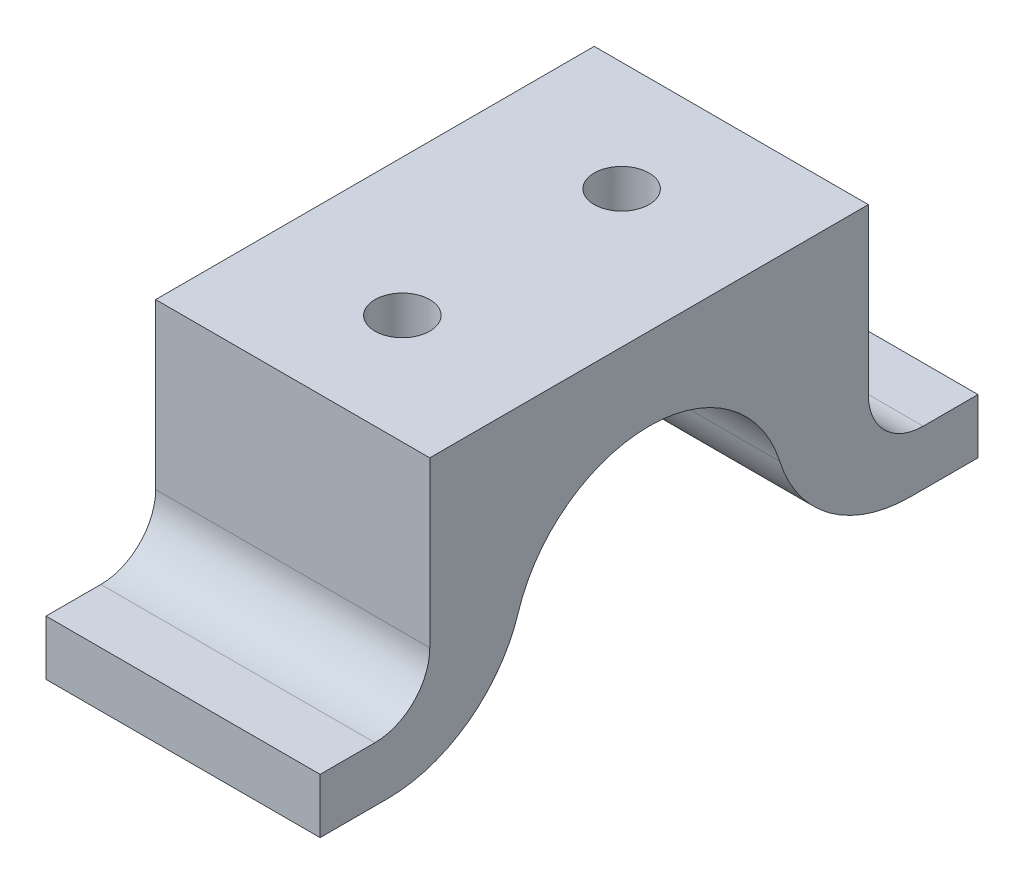
ISO-10303-21;
HEADER;
FILE_DESCRIPTION(('STEP AP214'),'2;1');
FILE_NAME('part.step','',(''),(''),'','','');
FILE_SCHEMA(('AUTOMOTIVE_DESIGN { 1 0 10303 214 1 1 1 1 }'));
ENDSEC;
DATA;
#1=APPLICATION_CONTEXT('core data for automotive mechanical design processes');
#2=APPLICATION_PROTOCOL_DEFINITION('international standard','automotive_design',2000,#1);
#3=PRODUCT_CONTEXT('',#1,'mechanical');
#4=PRODUCT('Part','Part','',(#3));
#5=PRODUCT_RELATED_PRODUCT_CATEGORY('part','',(#4));
#6=PRODUCT_DEFINITION_FORMATION('','',#4);
#7=PRODUCT_DEFINITION_CONTEXT('part definition',#1,'design');
#8=PRODUCT_DEFINITION('design','',#6,#7);
#9=PRODUCT_DEFINITION_SHAPE('','',#8);
#10=(LENGTH_UNIT() NAMED_UNIT(*) SI_UNIT(.MILLI.,.METRE.));
#11=(NAMED_UNIT(*) PLANE_ANGLE_UNIT() SI_UNIT($,.RADIAN.));
#12=(NAMED_UNIT(*) SI_UNIT($,.STERADIAN.) SOLID_ANGLE_UNIT());
#13=UNCERTAINTY_MEASURE_WITH_UNIT(LENGTH_MEASURE(1.E-05),#10,'distance_accuracy_value','');
#14=(GEOMETRIC_REPRESENTATION_CONTEXT(3) GLOBAL_UNCERTAINTY_ASSIGNED_CONTEXT((#13)) GLOBAL_UNIT_ASSIGNED_CONTEXT((#10,
#11,#12)) REPRESENTATION_CONTEXT('',''));
#15=CARTESIAN_POINT('',(0.,0.,0.));
#16=DIRECTION('',(0.,0.,1.));
#17=DIRECTION('',(1.,0.,0.));
#18=AXIS2_PLACEMENT_3D('',#15,#16,#17);
#19=CARTESIAN_POINT('',(5.,22.,-5.5));
#20=DIRECTION('',(-1.,0.,0.));
#21=DIRECTION('',(0.,-1.,0.));
#22=AXIS2_PLACEMENT_3D('',#19,#20,#21);
#23=PLANE('',#22);
#24=CARTESIAN_POINT('',(5.,17.,2.5));
#25=DIRECTION('',(-1.,0.,0.));
#26=DIRECTION('',(0.,-1.,0.));
#27=AXIS2_PLACEMENT_3D('',#24,#25,#26);
#28=CIRCLE('',#27,5.);
#29=CARTESIAN_POINT('',(5.,22.,2.5));
#30=VERTEX_POINT('',#29);
#31=CARTESIAN_POINT('',(5.,18.5,-2.26969600708473));
#32=VERTEX_POINT('',#31);
#33=EDGE_CURVE('E272',#30,#32,#28,.T.);
#34=ORIENTED_EDGE('',*,*,#33,.T.);
#35=CARTESIAN_POINT('',(5.,20.,-7.03939201416946));
#36=DIRECTION('',(-1.,0.,0.));
#37=DIRECTION('',(0.,-1.,0.));
#38=AXIS2_PLACEMENT_3D('',#35,#36,#37);
#39=CIRCLE('',#38,5.);
#40=CARTESIAN_POINT('',(5.,15.,-7.03939201416946));
#41=VERTEX_POINT('',#40);
#42=EDGE_CURVE('E188',#32,#41,#39,.F.);
#43=ORIENTED_EDGE('',*,*,#42,.T.);
#44=DIRECTION('',(0.,0.,1.));
#45=VECTOR('',#44,1.);
#46=CARTESIAN_POINT('',(5.,15.,-2.5));
#47=LINE('',#46,#45);
#48=CARTESIAN_POINT('',(5.,15.,-9.5));
#49=VERTEX_POINT('',#48);
#50=EDGE_CURVE('E350',#49,#41,#47,.T.);
#51=ORIENTED_EDGE('',*,*,#50,.F.);
#52=DIRECTION('',(0.,1.,0.));
#53=VECTOR('',#52,1.);
#54=CARTESIAN_POINT('',(5.,15.,-9.5));
#55=LINE('',#54,#53);
#56=CARTESIAN_POINT('',(5.,17.,-9.5));
#57=VERTEX_POINT('',#56);
#58=EDGE_CURVE('E346',#49,#57,#55,.T.);
#59=ORIENTED_EDGE('',*,*,#58,.T.);
#60=DIRECTION('',(0.,0.,1.));
#61=VECTOR('',#60,1.);
#62=CARTESIAN_POINT('',(5.,17.,-2.5));
#63=LINE('',#62,#61);
#64=CARTESIAN_POINT('',(5.,17.,-7.5));
#65=VERTEX_POINT('',#64);
#66=EDGE_CURVE('E351',#57,#65,#63,.T.);
#67=ORIENTED_EDGE('',*,*,#66,.T.);
#68=CARTESIAN_POINT('',(5.,19.,-7.5));
#69=DIRECTION('',(-1.,0.,0.));
#70=DIRECTION('',(0.,-1.,0.));
#71=AXIS2_PLACEMENT_3D('',#68,#69,#70);
#72=CIRCLE('',#71,2.);
#73=CARTESIAN_POINT('',(5.,19.,-5.5));
#74=VERTEX_POINT('',#73);
#75=EDGE_CURVE('E205',#65,#74,#72,.T.);
#76=ORIENTED_EDGE('',*,*,#75,.T.);
#77=DIRECTION('',(0.,1.,0.));
#78=VECTOR('',#77,1.);
#79=CARTESIAN_POINT('',(5.,22.,-5.5));
#80=LINE('',#79,#78);
#81=CARTESIAN_POINT('',(4.99999999999999,25.,-5.5));
#82=VERTEX_POINT('',#81);
#83=EDGE_CURVE('E323',#74,#82,#80,.T.);
#84=ORIENTED_EDGE('',*,*,#83,.T.);
#85=DIRECTION('',(0.,0.,1.));
#86=VECTOR('',#85,1.);
#87=CARTESIAN_POINT('',(4.99999999999999,25.,-5.5));
#88=LINE('',#87,#86);
#89=CARTESIAN_POINT('',(5.,25.,10.5));
#90=VERTEX_POINT('',#89);
#91=EDGE_CURVE('E338',#82,#90,#88,.T.);
#92=ORIENTED_EDGE('',*,*,#91,.T.);
#93=DIRECTION('',(0.,1.,0.));
#94=VECTOR('',#93,1.);
#95=CARTESIAN_POINT('',(5.,22.,10.5));
#96=LINE('',#95,#94);
#97=CARTESIAN_POINT('',(5.,19.,10.5));
#98=VERTEX_POINT('',#97);
#99=EDGE_CURVE('E314',#98,#90,#96,.T.);
#100=ORIENTED_EDGE('',*,*,#99,.F.);
#101=CARTESIAN_POINT('',(5.,19.,12.5));
#102=DIRECTION('',(-1.,0.,0.));
#103=DIRECTION('',(0.,-1.,0.));
#104=AXIS2_PLACEMENT_3D('',#101,#102,#103);
#105=CIRCLE('',#104,2.);
#106=CARTESIAN_POINT('',(5.,17.,12.5));
#107=VERTEX_POINT('',#106);
#108=EDGE_CURVE('E166',#98,#107,#105,.T.);
#109=ORIENTED_EDGE('',*,*,#108,.T.);
#110=DIRECTION('',(0.,0.,1.));
#111=VECTOR('',#110,1.);
#112=CARTESIAN_POINT('',(5.,17.,7.5));
#113=LINE('',#112,#111);
#114=CARTESIAN_POINT('',(5.,17.,14.5));
#115=VERTEX_POINT('',#114);
#116=EDGE_CURVE('E382',#107,#115,#113,.T.);
#117=ORIENTED_EDGE('',*,*,#116,.T.);
#118=DIRECTION('',(0.,1.,0.));
#119=VECTOR('',#118,1.);
#120=CARTESIAN_POINT('',(5.,15.,14.5));
#121=LINE('',#120,#119);
#122=CARTESIAN_POINT('',(5.,15.,14.5));
#123=VERTEX_POINT('',#122);
#124=EDGE_CURVE('E362',#123,#115,#121,.T.);
#125=ORIENTED_EDGE('',*,*,#124,.F.);
#126=DIRECTION('',(0.,0.,1.));
#127=VECTOR('',#126,1.);
#128=CARTESIAN_POINT('',(5.,15.,7.5));
#129=LINE('',#128,#127);
#130=CARTESIAN_POINT('',(5.,15.,12.0393920141695));
#131=VERTEX_POINT('',#130);
#132=EDGE_CURVE('E390',#131,#123,#129,.T.);
#133=ORIENTED_EDGE('',*,*,#132,.F.);
#134=CARTESIAN_POINT('',(5.,20.,12.0393920141695));
#135=DIRECTION('',(-1.,0.,0.));
#136=DIRECTION('',(0.,-1.,0.));
#137=AXIS2_PLACEMENT_3D('',#134,#135,#136);
#138=CIRCLE('',#137,5.);
#139=CARTESIAN_POINT('',(5.,18.5,7.26969600708473));
#140=VERTEX_POINT('',#139);
#141=EDGE_CURVE('E288',#131,#140,#138,.F.);
#142=ORIENTED_EDGE('',*,*,#141,.T.);
#143=CARTESIAN_POINT('',(5.,17.,2.5));
#144=DIRECTION('',(-1.,0.,0.));
#145=DIRECTION('',(0.,-1.,0.));
#146=AXIS2_PLACEMENT_3D('',#143,#144,#145);
#147=CIRCLE('',#146,5.);
#148=EDGE_CURVE('E276',#140,#30,#147,.T.);
#149=ORIENTED_EDGE('',*,*,#148,.T.);
#150=EDGE_LOOP('',(#34,#43,#51,#59,#67,#76,#84,#92,#100,#109,#117,#125,#133,#142,#149));
#151=FACE_BOUND('',#150,.T.);
#152=ADVANCED_FACE('F38',(#151),#23,.F.);
#153=CARTESIAN_POINT('',(5.,22.,10.5));
#154=DIRECTION('',(0.,0.,-1.));
#155=DIRECTION('',(-1.,0.,0.));
#156=AXIS2_PLACEMENT_3D('',#153,#154,#155);
#157=PLANE('',#156);
#158=DIRECTION('',(0.,1.,0.));
#159=VECTOR('',#158,1.);
#160=CARTESIAN_POINT('',(-5.00000000000001,22.,10.5));
#161=LINE('',#160,#159);
#162=CARTESIAN_POINT('',(-5.,19.,10.5));
#163=VERTEX_POINT('',#162);
#164=CARTESIAN_POINT('',(-5.00000000000001,25.,10.5));
#165=VERTEX_POINT('',#164);
#166=EDGE_CURVE('E317',#163,#165,#161,.T.);
#167=ORIENTED_EDGE('',*,*,#166,.F.);
#168=DIRECTION('',(-1.,0.,0.));
#169=VECTOR('',#168,1.);
#170=CARTESIAN_POINT('',(5.,19.,10.5));
#171=LINE('',#170,#169);
#172=EDGE_CURVE('E202',#163,#98,#171,.F.);
#173=ORIENTED_EDGE('',*,*,#172,.T.);
#174=ORIENTED_EDGE('',*,*,#99,.T.);
#175=DIRECTION('',(-1.,0.,0.));
#176=VECTOR('',#175,1.);
#177=CARTESIAN_POINT('',(5.,25.,10.5));
#178=LINE('',#177,#176);
#179=EDGE_CURVE('E334',#90,#165,#178,.T.);
#180=ORIENTED_EDGE('',*,*,#179,.T.);
#181=EDGE_LOOP('',(#167,#173,#174,#180));
#182=FACE_BOUND('',#181,.T.);
#183=ADVANCED_FACE('F263',(#182),#157,.F.);
#184=CARTESIAN_POINT('',(-5.,22.,-5.5));
#185=DIRECTION('',(1.,0.,0.));
#186=DIRECTION('',(0.,1.,0.));
#187=AXIS2_PLACEMENT_3D('',#184,#185,#186);
#188=PLANE('',#187);
#189=DIRECTION('',(0.,0.,-1.));
#190=VECTOR('',#189,1.);
#191=CARTESIAN_POINT('',(-5.,15.,-2.5));
#192=LINE('',#191,#190);
#193=CARTESIAN_POINT('',(-5.,15.,-7.03939201416946));
#194=VERTEX_POINT('',#193);
#195=CARTESIAN_POINT('',(-5.,15.,-9.5));
#196=VERTEX_POINT('',#195);
#197=EDGE_CURVE('E355',#194,#196,#192,.T.);
#198=ORIENTED_EDGE('',*,*,#197,.F.);
#199=CARTESIAN_POINT('',(-5.,20.,-7.03939201416946));
#200=DIRECTION('',(1.,0.,0.));
#201=DIRECTION('',(0.,1.,0.));
#202=AXIS2_PLACEMENT_3D('',#199,#200,#201);
#203=CIRCLE('',#202,5.);
#204=CARTESIAN_POINT('',(-5.,18.5,-2.26969600708473));
#205=VERTEX_POINT('',#204);
#206=EDGE_CURVE('E296',#194,#205,#203,.F.);
#207=ORIENTED_EDGE('',*,*,#206,.T.);
#208=CARTESIAN_POINT('',(-5.,17.,2.5));
#209=DIRECTION('',(1.,0.,0.));
#210=DIRECTION('',(0.,1.,0.));
#211=AXIS2_PLACEMENT_3D('',#208,#209,#210);
#212=CIRCLE('',#211,5.);
#213=CARTESIAN_POINT('',(-5.,22.,2.5));
#214=VERTEX_POINT('',#213);
#215=EDGE_CURVE('E281',#205,#214,#212,.T.);
#216=ORIENTED_EDGE('',*,*,#215,.T.);
#217=CARTESIAN_POINT('',(-5.,17.,2.5));
#218=DIRECTION('',(1.,0.,0.));
#219=DIRECTION('',(0.,1.,0.));
#220=AXIS2_PLACEMENT_3D('',#217,#218,#219);
#221=CIRCLE('',#220,5.);
#222=CARTESIAN_POINT('',(-5.,18.5,7.26969600708473));
#223=VERTEX_POINT('',#222);
#224=EDGE_CURVE('E309',#214,#223,#221,.T.);
#225=ORIENTED_EDGE('',*,*,#224,.T.);
#226=CARTESIAN_POINT('',(-5.00000000000001,20.,12.0393920141695));
#227=DIRECTION('',(1.,0.,0.));
#228=DIRECTION('',(0.,1.,0.));
#229=AXIS2_PLACEMENT_3D('',#226,#227,#228);
#230=CIRCLE('',#229,5.);
#231=CARTESIAN_POINT('',(-5.,15.,12.0393920141695));
#232=VERTEX_POINT('',#231);
#233=EDGE_CURVE('E180',#223,#232,#230,.F.);
#234=ORIENTED_EDGE('',*,*,#233,.T.);
#235=DIRECTION('',(0.,0.,-1.));
#236=VECTOR('',#235,1.);
#237=CARTESIAN_POINT('',(-5.,15.,7.5));
#238=LINE('',#237,#236);
#239=CARTESIAN_POINT('',(-5.,15.,14.5));
#240=VERTEX_POINT('',#239);
#241=EDGE_CURVE('E381',#240,#232,#238,.T.);
#242=ORIENTED_EDGE('',*,*,#241,.F.);
#243=DIRECTION('',(0.,1.,0.));
#244=VECTOR('',#243,1.);
#245=CARTESIAN_POINT('',(-5.,15.,14.5));
#246=LINE('',#245,#244);
#247=CARTESIAN_POINT('',(-5.,17.,14.5));
#248=VERTEX_POINT('',#247);
#249=EDGE_CURVE('E373',#240,#248,#246,.T.);
#250=ORIENTED_EDGE('',*,*,#249,.T.);
#251=DIRECTION('',(0.,0.,-1.));
#252=VECTOR('',#251,1.);
#253=CARTESIAN_POINT('',(-5.,17.,7.5));
#254=LINE('',#253,#252);
#255=CARTESIAN_POINT('',(-5.,17.,12.5));
#256=VERTEX_POINT('',#255);
#257=EDGE_CURVE('E305',#248,#256,#254,.T.);
#258=ORIENTED_EDGE('',*,*,#257,.T.);
#259=CARTESIAN_POINT('',(-5.,19.,12.5));
#260=DIRECTION('',(1.,0.,0.));
#261=DIRECTION('',(0.,1.,0.));
#262=AXIS2_PLACEMENT_3D('',#259,#260,#261);
#263=CIRCLE('',#262,2.);
#264=EDGE_CURVE('E211',#256,#163,#263,.T.);
#265=ORIENTED_EDGE('',*,*,#264,.T.);
#266=ORIENTED_EDGE('',*,*,#166,.T.);
#267=DIRECTION('',(0.,0.,-1.));
#268=VECTOR('',#267,1.);
#269=CARTESIAN_POINT('',(-5.00000000000001,25.,-5.5));
#270=LINE('',#269,#268);
#271=CARTESIAN_POINT('',(-5.00000000000001,25.,-5.5));
#272=VERTEX_POINT('',#271);
#273=EDGE_CURVE('E330',#165,#272,#270,.T.);
#274=ORIENTED_EDGE('',*,*,#273,.T.);
#275=DIRECTION('',(0.,1.,0.));
#276=VECTOR('',#275,1.);
#277=CARTESIAN_POINT('',(-5.,22.,-5.5));
#278=LINE('',#277,#276);
#279=CARTESIAN_POINT('',(-5.,19.,-5.5));
#280=VERTEX_POINT('',#279);
#281=EDGE_CURVE('E320',#280,#272,#278,.T.);
#282=ORIENTED_EDGE('',*,*,#281,.F.);
#283=CARTESIAN_POINT('',(-5.,19.,-7.5));
#284=DIRECTION('',(1.,0.,0.));
#285=DIRECTION('',(0.,1.,0.));
#286=AXIS2_PLACEMENT_3D('',#283,#284,#285);
#287=CIRCLE('',#286,2.);
#288=CARTESIAN_POINT('',(-5.,17.,-7.5));
#289=VERTEX_POINT('',#288);
#290=EDGE_CURVE('E208',#280,#289,#287,.T.);
#291=ORIENTED_EDGE('',*,*,#290,.T.);
#292=DIRECTION('',(0.,0.,-1.));
#293=VECTOR('',#292,1.);
#294=CARTESIAN_POINT('',(-5.,17.,-2.5));
#295=LINE('',#294,#293);
#296=CARTESIAN_POINT('',(-5.,17.,-9.5));
#297=VERTEX_POINT('',#296);
#298=EDGE_CURVE('E359',#289,#297,#295,.T.);
#299=ORIENTED_EDGE('',*,*,#298,.T.);
#300=DIRECTION('',(0.,1.,0.));
#301=VECTOR('',#300,1.);
#302=CARTESIAN_POINT('',(-5.,15.,-9.5));
#303=LINE('',#302,#301);
#304=EDGE_CURVE('E342',#196,#297,#303,.T.);
#305=ORIENTED_EDGE('',*,*,#304,.F.);
#306=EDGE_LOOP('',(#198,#207,#216,#225,#234,#242,#250,#258,#265,#266,#274,#282,#291,#299,#305));
#307=FACE_BOUND('',#306,.T.);
#308=ADVANCED_FACE('F268',(#307),#188,.F.);
#309=CARTESIAN_POINT('',(5.,22.,-5.5));
#310=DIRECTION('',(0.,0.,1.));
#311=DIRECTION('',(1.,0.,0.));
#312=AXIS2_PLACEMENT_3D('',#309,#310,#311);
#313=PLANE('',#312);
#314=ORIENTED_EDGE('',*,*,#83,.F.);
#315=DIRECTION('',(1.,0.,0.));
#316=VECTOR('',#315,1.);
#317=CARTESIAN_POINT('',(-5.,19.,-5.5));
#318=LINE('',#317,#316);
#319=EDGE_CURVE('E195',#74,#280,#318,.F.);
#320=ORIENTED_EDGE('',*,*,#319,.T.);
#321=ORIENTED_EDGE('',*,*,#281,.T.);
#322=DIRECTION('',(1.,0.,0.));
#323=VECTOR('',#322,1.);
#324=CARTESIAN_POINT('',(4.99999999999999,25.,-5.5));
#325=LINE('',#324,#323);
#326=EDGE_CURVE('E326',#272,#82,#325,.T.);
#327=ORIENTED_EDGE('',*,*,#326,.T.);
#328=EDGE_LOOP('',(#314,#320,#321,#327));
#329=FACE_BOUND('',#328,.T.);
#330=ADVANCED_FACE('F414',(#329),#313,.F.);
#331=CARTESIAN_POINT('',(0.,25.,0.));
#332=DIRECTION('',(0.,-1.,0.));
#333=DIRECTION('',(0.,0.,-1.));
#334=AXIS2_PLACEMENT_3D('',#331,#332,#333);
#335=PLANE('',#334);
#336=CARTESIAN_POINT('',(0.,25.,-1.5));
#337=DIRECTION('',(0.,1.,0.));
#338=DIRECTION('',(0.,0.,1.));
#339=AXIS2_PLACEMENT_3D('',#336,#337,#338);
#340=CIRCLE('',#339,1.);
#341=CARTESIAN_POINT('',(0.,25.,-0.500000000000002));
#342=VERTEX_POINT('',#341);
#343=EDGE_CURVE('E175',#342,#342,#340,.T.);
#344=ORIENTED_EDGE('',*,*,#343,.F.);
#345=EDGE_LOOP('',(#344));
#346=FACE_BOUND('',#345,.T.);
#347=CARTESIAN_POINT('',(0.,25.,6.5));
#348=DIRECTION('',(0.,1.,0.));
#349=DIRECTION('',(0.,0.,1.));
#350=AXIS2_PLACEMENT_3D('',#347,#348,#349);
#351=CIRCLE('',#350,1.);
#352=CARTESIAN_POINT('',(0.,25.,7.5));
#353=VERTEX_POINT('',#352);
#354=EDGE_CURVE('E238',#353,#353,#351,.T.);
#355=ORIENTED_EDGE('',*,*,#354,.F.);
#356=EDGE_LOOP('',(#355));
#357=FACE_BOUND('',#356,.T.);
#358=ORIENTED_EDGE('',*,*,#91,.F.);
#359=ORIENTED_EDGE('',*,*,#326,.F.);
#360=ORIENTED_EDGE('',*,*,#273,.F.);
#361=ORIENTED_EDGE('',*,*,#179,.F.);
#362=EDGE_LOOP('',(#358,#359,#360,#361));
#363=FACE_BOUND('',#362,.T.);
#364=ADVANCED_FACE('F410',(#346,#357,#363),#335,.F.);
#365=CARTESIAN_POINT('',(0.,17.,0.));
#366=DIRECTION('',(0.,-1.,0.));
#367=DIRECTION('',(0.,0.,-1.));
#368=AXIS2_PLACEMENT_3D('',#365,#366,#367);
#369=PLANE('',#368);
#370=ORIENTED_EDGE('',*,*,#298,.F.);
#371=DIRECTION('',(1.,0.,0.));
#372=VECTOR('',#371,1.);
#373=CARTESIAN_POINT('',(5.,17.,-7.5));
#374=LINE('',#373,#372);
#375=EDGE_CURVE('E186',#289,#65,#374,.T.);
#376=ORIENTED_EDGE('',*,*,#375,.T.);
#377=ORIENTED_EDGE('',*,*,#66,.F.);
#378=DIRECTION('',(1.,0.,0.));
#379=VECTOR('',#378,1.);
#380=CARTESIAN_POINT('',(-5.,17.,-9.5));
#381=LINE('',#380,#379);
#382=EDGE_CURVE('E356',#297,#57,#381,.T.);
#383=ORIENTED_EDGE('',*,*,#382,.F.);
#384=EDGE_LOOP('',(#370,#376,#377,#383));
#385=FACE_BOUND('',#384,.T.);
#386=ADVANCED_FACE('F413',(#385),#369,.F.);
#387=CARTESIAN_POINT('',(-5.,15.,-9.5));
#388=DIRECTION('',(0.,0.,1.));
#389=DIRECTION('',(1.,0.,0.));
#390=AXIS2_PLACEMENT_3D('',#387,#388,#389);
#391=PLANE('',#390);
#392=ORIENTED_EDGE('',*,*,#382,.T.);
#393=ORIENTED_EDGE('',*,*,#58,.F.);
#394=DIRECTION('',(1.,0.,0.));
#395=VECTOR('',#394,1.);
#396=CARTESIAN_POINT('',(-5.,15.,-9.5));
#397=LINE('',#396,#395);
#398=EDGE_CURVE('E365',#196,#49,#397,.T.);
#399=ORIENTED_EDGE('',*,*,#398,.F.);
#400=ORIENTED_EDGE('',*,*,#304,.T.);
#401=EDGE_LOOP('',(#392,#393,#399,#400));
#402=FACE_BOUND('',#401,.T.);
#403=ADVANCED_FACE('F450',(#402),#391,.F.);
#404=CARTESIAN_POINT('',(0.,15.,0.));
#405=DIRECTION('',(0.,-1.,0.));
#406=DIRECTION('',(0.,0.,-1.));
#407=AXIS2_PLACEMENT_3D('',#404,#405,#406);
#408=PLANE('',#407);
#409=ORIENTED_EDGE('',*,*,#50,.T.);
#410=DIRECTION('',(1.,0.,0.));
#411=VECTOR('',#410,1.);
#412=CARTESIAN_POINT('',(-5.,15.,-7.03939201416946));
#413=LINE('',#412,#411);
#414=EDGE_CURVE('E280',#41,#194,#413,.F.);
#415=ORIENTED_EDGE('',*,*,#414,.T.);
#416=ORIENTED_EDGE('',*,*,#197,.T.);
#417=ORIENTED_EDGE('',*,*,#398,.T.);
#418=EDGE_LOOP('',(#409,#415,#416,#417));
#419=FACE_BOUND('',#418,.T.);
#420=ADVANCED_FACE('F446',(#419),#408,.T.);
#421=CARTESIAN_POINT('',(0.,17.,0.));
#422=DIRECTION('',(0.,1.,0.));
#423=DIRECTION('',(0.,0.,1.));
#424=AXIS2_PLACEMENT_3D('',#421,#422,#423);
#425=PLANE('',#424);
#426=ORIENTED_EDGE('',*,*,#116,.F.);
#427=DIRECTION('',(-1.,0.,0.));
#428=VECTOR('',#427,1.);
#429=CARTESIAN_POINT('',(0.,17.,12.5));
#430=LINE('',#429,#428);
#431=EDGE_CURVE('E198',#107,#256,#430,.T.);
#432=ORIENTED_EDGE('',*,*,#431,.T.);
#433=ORIENTED_EDGE('',*,*,#257,.F.);
#434=DIRECTION('',(-1.,0.,0.));
#435=VECTOR('',#434,1.);
#436=CARTESIAN_POINT('',(-5.,17.,14.5));
#437=LINE('',#436,#435);
#438=EDGE_CURVE('E378',#115,#248,#437,.T.);
#439=ORIENTED_EDGE('',*,*,#438,.F.);
#440=EDGE_LOOP('',(#426,#432,#433,#439));
#441=FACE_BOUND('',#440,.T.);
#442=ADVANCED_FACE('F436',(#441),#425,.T.);
#443=CARTESIAN_POINT('',(-5.,15.,14.5));
#444=DIRECTION('',(0.,0.,-1.));
#445=DIRECTION('',(-1.,0.,0.));
#446=AXIS2_PLACEMENT_3D('',#443,#444,#445);
#447=PLANE('',#446);
#448=ORIENTED_EDGE('',*,*,#438,.T.);
#449=ORIENTED_EDGE('',*,*,#249,.F.);
#450=DIRECTION('',(-1.,0.,0.));
#451=VECTOR('',#450,1.);
#452=CARTESIAN_POINT('',(-5.,15.,14.5));
#453=LINE('',#452,#451);
#454=EDGE_CURVE('E377',#123,#240,#453,.T.);
#455=ORIENTED_EDGE('',*,*,#454,.F.);
#456=ORIENTED_EDGE('',*,*,#124,.T.);
#457=EDGE_LOOP('',(#448,#449,#455,#456));
#458=FACE_BOUND('',#457,.T.);
#459=ADVANCED_FACE('F439',(#458),#447,.F.);
#460=CARTESIAN_POINT('',(0.,15.,0.));
#461=DIRECTION('',(0.,1.,0.));
#462=DIRECTION('',(0.,0.,1.));
#463=AXIS2_PLACEMENT_3D('',#460,#461,#462);
#464=PLANE('',#463);
#465=ORIENTED_EDGE('',*,*,#241,.T.);
#466=DIRECTION('',(1.,0.,0.));
#467=VECTOR('',#466,1.);
#468=CARTESIAN_POINT('',(0.,15.,12.0393920141695));
#469=LINE('',#468,#467);
#470=EDGE_CURVE('E182',#232,#131,#469,.T.);
#471=ORIENTED_EDGE('',*,*,#470,.T.);
#472=ORIENTED_EDGE('',*,*,#132,.T.);
#473=ORIENTED_EDGE('',*,*,#454,.T.);
#474=EDGE_LOOP('',(#465,#471,#472,#473));
#475=FACE_BOUND('',#474,.T.);
#476=ADVANCED_FACE('F228',(#475),#464,.F.);
#477=CARTESIAN_POINT('',(-5.,17.,2.5));
#478=DIRECTION('',(-1.,0.,0.));
#479=DIRECTION('',(0.,0.,1.));
#480=AXIS2_PLACEMENT_3D('',#477,#478,#479);
#481=CYLINDRICAL_SURFACE('',#480,5.);
#482=DIRECTION('',(-1.,0.,0.));
#483=VECTOR('',#482,1.);
#484=CARTESIAN_POINT('',(-5.,18.5,-2.26969600708473));
#485=LINE('',#484,#483);
#486=CARTESIAN_POINT('',(-0.638410570618804,18.5,-2.26969600708473));
#487=VERTEX_POINT('',#486);
#488=EDGE_CURVE('E290',#205,#487,#485,.F.);
#489=ORIENTED_EDGE('',*,*,#488,.T.);
#490=CARTESIAN_POINT('',(-0.638410570618804,18.5,-2.26969600708473));
#491=CARTESIAN_POINT('',(-0.678780713720072,18.6066160043357,-2.23616493085874));
#492=CARTESIAN_POINT('',(-0.717353140401096,18.7128223382224,-2.198837692223));
#493=CARTESIAN_POINT('',(-0.789507120602234,18.9244473622601,-2.11621837146572));
#494=CARTESIAN_POINT('',(-0.823064114185859,19.0298599205234,-2.0708893226854));
#495=CARTESIAN_POINT('',(-0.883720946613548,19.2400946230633,-1.97164847930781));
#496=CARTESIAN_POINT('',(-0.91074315081412,19.3448964771089,-1.91764508583745));
#497=CARTESIAN_POINT('',(-0.955503054251949,19.5517400500821,-1.80146902668691));
#498=CARTESIAN_POINT('',(-0.973261519117577,19.6537874518244,-1.73931502654666));
#499=CARTESIAN_POINT('',(-0.989794579810819,19.796278246968,-1.64528755324994));
#500=CARTESIAN_POINT('',(-0.993610565765695,19.8382928236756,-1.61663493022378));
#501=CARTESIAN_POINT('',(-0.998751574312479,19.9215286133693,-1.55798781418742));
#502=CARTESIAN_POINT('',(-1.00007655720102,19.9627498136997,-1.527993299797));
#503=CARTESIAN_POINT('',(-0.999836637029939,20.0849459606624,-1.4361721073614));
#504=CARTESIAN_POINT('',(-0.994071856990848,20.1645687492104,-1.37243175296329));
#505=CARTESIAN_POINT('',(-0.968091567407124,20.3196523496411,-1.24037843134804));
#506=CARTESIAN_POINT('',(-0.947663581992158,20.3950341840395,-1.17201177602054));
#507=CARTESIAN_POINT('',(-0.888317262041968,20.5376501051655,-1.03478289858702));
#508=CARTESIAN_POINT('',(-0.849474599442692,20.6049161359613,-0.965923830314562));
#509=CARTESIAN_POINT('',(-0.771404662298519,20.7014008802972,-0.861897208764831));
#510=CARTESIAN_POINT('',(-0.739454361740448,20.7345835235384,-0.824921318922943));
#511=CARTESIAN_POINT('',(-0.668142213716893,20.796294504039,-0.754278947284466));
#512=CARTESIAN_POINT('',(-0.628782118729357,20.8248239388492,-0.72061168582957));
#513=CARTESIAN_POINT('',(-0.542446283424948,20.8765171317092,-0.658208425765767));
#514=CARTESIAN_POINT('',(-0.495403156030903,20.899628550722,-0.629521172197206));
#515=CARTESIAN_POINT('',(-0.394957995342171,20.9391755130709,-0.579597189611281));
#516=CARTESIAN_POINT('',(-0.341562544602818,20.9556178905588,-0.558352836481784));
#517=CARTESIAN_POINT('',(-0.23806361349184,20.9792949665805,-0.527463931405553));
#518=CARTESIAN_POINT('',(-0.188538713089397,20.9874936539119,-0.516615253352061));
#519=CARTESIAN_POINT('',(-0.0878147052608052,20.9980817282582,-0.502569561939051));
#520=CARTESIAN_POINT('',(-0.036616721840531,21.0004749373604,-0.499367514375186));
#521=CARTESIAN_POINT('',(0.0601663413117233,20.9994264122775,-0.50076409484583));
#522=CARTESIAN_POINT('',(0.105772372617751,20.9965750240358,-0.504573524448832));
#523=CARTESIAN_POINT('',(0.195517575972819,20.986255886371,-0.518250619105255));
#524=CARTESIAN_POINT('',(0.239657010294994,20.9787889670816,-0.528117194738911));
#525=CARTESIAN_POINT('',(0.325227968987531,20.9594848074711,-0.553314338436215));
#526=CARTESIAN_POINT('',(0.366664498565019,20.9476559315249,-0.568634447010128));
#527=CARTESIAN_POINT('',(0.446040451890351,20.9199621484957,-0.603932745897208));
#528=CARTESIAN_POINT('',(0.483979126327362,20.9040963793533,-0.623911931057953));
#529=CARTESIAN_POINT('',(0.558821922623231,20.8672273261611,-0.66946020394253));
#530=CARTESIAN_POINT('',(0.595364958282541,20.845902296262,-0.695359802581954));
#531=CARTESIAN_POINT('',(0.663292763882802,20.7995323262807,-0.750361990878987));
#532=CARTESIAN_POINT('',(0.694674447667567,20.7744851775244,-0.779466479617489));
#533=CARTESIAN_POINT('',(0.765618806086598,20.7088225615693,-0.853816071382028));
#534=CARTESIAN_POINT('',(0.802217769051678,20.6663771702413,-0.90028260544219));
#535=CARTESIAN_POINT('',(0.865020955632485,20.5761738109451,-0.995038664406096));
#536=CARTESIAN_POINT('',(0.891203621433832,20.5284050843839,-1.04333174583627));
#537=CARTESIAN_POINT('',(0.943420178773924,20.4079151770365,-1.16002000920112));
#538=CARTESIAN_POINT('',(0.964788967692513,20.3331294169158,-1.22835395300911));
#539=CARTESIAN_POINT('',(0.99270282583484,20.1779558112841,-1.36149251279971));
#540=CARTESIAN_POINT('',(0.999223356861997,20.097558918428,-1.42629111408763));
#541=CARTESIAN_POINT('',(1.00048784832382,19.9511155087029,-1.53700284892115));
#542=CARTESIAN_POINT('',(0.997514950407655,19.885821816142,-1.58392595050566));
#543=CARTESIAN_POINT('',(0.985737538216701,19.7533961458076,-1.67435600078796));
#544=CARTESIAN_POINT('',(0.976929548983148,19.6862630954974,-1.71786089656951));
#545=CARTESIAN_POINT('',(0.943264069300359,19.4823984216427,-1.84317327795747));
#546=CARTESIAN_POINT('',(0.911172279584435,19.3434930517284,-1.91955883560148));
#547=CARTESIAN_POINT('',(0.840688242958332,19.0870725819211,-2.04541886486336));
#548=CARTESIAN_POINT('',(0.804395946300605,18.9700908321343,-2.09726356236579));
#549=CARTESIAN_POINT('',(0.745213492702987,18.7939374674681,-2.16751884301116));
#550=CARTESIAN_POINT('',(0.724798320239552,18.7353728911317,-2.18960202976779));
#551=CARTESIAN_POINT('',(0.682586037497037,18.6179197540557,-2.23140791801381));
#552=CARTESIAN_POINT('',(0.660789316736855,18.559031288873,-2.25113128035208));
#553=CARTESIAN_POINT('',(0.638410570618804,18.5,-2.26969600708473));
#554=B_SPLINE_CURVE_WITH_KNOTS('',3,(#490,#491,#492,#493,#494,#495,#496,#497,#498,#499,#500,
#501,#502,#503,#504,#505,#506,#507,#508,#509,#510,#511,#512,#513,#514,#515,#516,#517,#518,#519,
#520,#521,#522,#523,#524,#525,#526,#527,#528,#529,#530,#531,#532,#533,#534,#535,#536,#537,#538,
#539,#540,#541,#542,#543,#544,#545,#546,#547,#548,#549,#550,#551,#552,#553),.UNSPECIFIED.,.F.,
.F.,(4,2,2,2,2,2,2,2,2,2,2,2,2,2,2,2,2,2,2,2,2,2,2,2,2,2,2,2,2,2,2,4),(0.,0.35656436277079,
0.714821274683616,1.07714554601965,1.43865410168222,1.59157357197225,1.74449547958007,
2.04992519179937,2.35987243601974,2.66855690199471,2.84515189972454,3.02170518362226,
3.19989953667855,3.3779108195088,3.53110915632095,3.68420660626388,3.821112159318,
3.95799309616896,4.09461290715362,4.23126191717378,4.37950859565212,4.52784359635267,
4.74502969333888,4.96266297413966,5.27154478867322,5.58093669126957,5.82198815455291,
6.06318329987105,6.5466568004049,6.94512156687121,7.1425739108382,7.33997082987684),.UNSPECIFIED.);
#555=CARTESIAN_POINT('',(0.638410570618803,18.5,-2.26969600708473));
#556=VERTEX_POINT('',#555);
#557=EDGE_CURVE('E58',#487,#556,#554,.T.);
#558=ORIENTED_EDGE('',*,*,#557,.T.);
#559=EDGE_CURVE('E285',#556,#32,#485,.F.);
#560=ORIENTED_EDGE('',*,*,#559,.T.);
#561=ORIENTED_EDGE('',*,*,#33,.F.);
#562=DIRECTION('',(-1.,0.,0.));
#563=VECTOR('',#562,1.);
#564=CARTESIAN_POINT('',(0.,22.,2.5));
#565=LINE('',#564,#563);
#566=EDGE_CURVE('E303',#214,#30,#565,.F.);
#567=ORIENTED_EDGE('',*,*,#566,.F.);
#568=ORIENTED_EDGE('',*,*,#215,.F.);
#569=EDGE_LOOP('',(#489,#558,#560,#561,#567,#568));
#570=FACE_BOUND('',#569,.T.);
#571=ADVANCED_FACE('F250',(#570),#481,.F.);
#572=CARTESIAN_POINT('',(-5.,17.,2.5));
#573=DIRECTION('',(1.,0.,0.));
#574=DIRECTION('',(0.,0.,-1.));
#575=AXIS2_PLACEMENT_3D('',#572,#573,#574);
#576=CYLINDRICAL_SURFACE('',#575,5.);
#577=DIRECTION('',(1.,0.,0.));
#578=VECTOR('',#577,1.);
#579=CARTESIAN_POINT('',(-5.,18.5,7.26969600708473));
#580=LINE('',#579,#578);
#581=CARTESIAN_POINT('',(0.638410570618801,18.5,7.26969600708473));
#582=VERTEX_POINT('',#581);
#583=EDGE_CURVE('E173',#140,#582,#580,.F.);
#584=ORIENTED_EDGE('',*,*,#583,.T.);
#585=CARTESIAN_POINT('',(0.638410570618801,18.5,7.26969600708473));
#586=CARTESIAN_POINT('',(0.678780713720069,18.6066160043357,7.23616493085874));
#587=CARTESIAN_POINT('',(0.717353140401093,18.7128223382224,7.198837692223));
#588=CARTESIAN_POINT('',(0.789507120602232,18.9244473622601,7.11621837146572));
#589=CARTESIAN_POINT('',(0.823064114185857,19.0298599205234,7.0708893226854));
#590=CARTESIAN_POINT('',(0.883720946613546,19.2400946230633,6.9716484793078));
#591=CARTESIAN_POINT('',(0.910743150814118,19.3448964771089,6.91764508583745));
#592=CARTESIAN_POINT('',(0.955503054251947,19.5517400500821,6.80146902668691));
#593=CARTESIAN_POINT('',(0.973261519117575,19.6537874518244,6.73931502654666));
#594=CARTESIAN_POINT('',(0.989794579810817,19.796278246968,6.64528755324994));
#595=CARTESIAN_POINT('',(0.993610565765694,19.8382928236756,6.61663493022378));
#596=CARTESIAN_POINT('',(0.998751574312479,19.9215286133693,6.55798781418742));
#597=CARTESIAN_POINT('',(1.00007655720102,19.9627498136996,6.527993299797));
#598=CARTESIAN_POINT('',(0.999836637029939,20.0849459606624,6.43617210736141));
#599=CARTESIAN_POINT('',(0.994071856990848,20.1645687492104,6.37243175296329));
#600=CARTESIAN_POINT('',(0.968091567407124,20.3196523496411,6.24037843134804));
#601=CARTESIAN_POINT('',(0.947663581992158,20.3950341840395,6.17201177602054));
#602=CARTESIAN_POINT('',(0.888317262041968,20.5376501051655,6.03478289858702));
#603=CARTESIAN_POINT('',(0.849474599442692,20.6049161359613,5.96592383031456));
#604=CARTESIAN_POINT('',(0.771404662298519,20.7014008802972,5.86189720876483));
#605=CARTESIAN_POINT('',(0.739454361740448,20.7345835235384,5.82492131892294));
#606=CARTESIAN_POINT('',(0.668142213716894,20.796294504039,5.75427894728446));
#607=CARTESIAN_POINT('',(0.628782118729358,20.8248239388492,5.72061168582957));
#608=CARTESIAN_POINT('',(0.54244628342495,20.8765171317092,5.65820842576576));
#609=CARTESIAN_POINT('',(0.495403156030906,20.899628550722,5.6295211721972));
#610=CARTESIAN_POINT('',(0.394957995342175,20.9391755130709,5.57959718961128));
#611=CARTESIAN_POINT('',(0.341562544602822,20.9556178905588,5.55835283648178));
#612=CARTESIAN_POINT('',(0.238063613491843,20.9792949665805,5.52746393140555));
#613=CARTESIAN_POINT('',(0.1885387130894,20.9874936539119,5.51661525335206));
#614=CARTESIAN_POINT('',(0.0878147052608077,20.9980817282582,5.50256956193905));
#615=CARTESIAN_POINT('',(0.0366167218405334,21.0004749373604,5.49936751437518));
#616=CARTESIAN_POINT('',(-0.0601663413117212,20.9994264122775,5.50076409484583));
#617=CARTESIAN_POINT('',(-0.105772372617749,20.9965750240358,5.50457352444883));
#618=CARTESIAN_POINT('',(-0.195517575972817,20.986255886371,5.51825061910525));
#619=CARTESIAN_POINT('',(-0.239657010294992,20.9787889670816,5.52811719473891));
#620=CARTESIAN_POINT('',(-0.325227968987529,20.9594848074711,5.55331433843621));
#621=CARTESIAN_POINT('',(-0.366664498565018,20.9476559315249,5.56863444701012));
#622=CARTESIAN_POINT('',(-0.44604045189035,20.9199621484957,5.6039327458972));
#623=CARTESIAN_POINT('',(-0.483979126327361,20.9040963793533,5.62391193105795));
#624=CARTESIAN_POINT('',(-0.558821922623229,20.8672273261611,5.66946020394253));
#625=CARTESIAN_POINT('',(-0.595364958282539,20.845902296262,5.69535980258195));
#626=CARTESIAN_POINT('',(-0.6632927638828,20.7995323262807,5.75036199087898));
#627=CARTESIAN_POINT('',(-0.694674447667565,20.7744851775244,5.77946647961748));
#628=CARTESIAN_POINT('',(-0.765618806086597,20.7088225615694,5.85381607138202));
#629=CARTESIAN_POINT('',(-0.802217769051676,20.6663771702413,5.90028260544218));
#630=CARTESIAN_POINT('',(-0.865020955632483,20.5761738109451,5.99503866440609));
#631=CARTESIAN_POINT('',(-0.89120362143383,20.5284050843839,6.04333174583627));
#632=CARTESIAN_POINT('',(-0.943420178773923,20.4079151770365,6.16002000920111));
#633=CARTESIAN_POINT('',(-0.964788967692512,20.3331294169158,6.22835395300911));
#634=CARTESIAN_POINT('',(-0.99270282583484,20.1779558112841,6.3614925127997));
#635=CARTESIAN_POINT('',(-0.999223356861996,20.097558918428,6.42629111408762));
#636=CARTESIAN_POINT('',(-1.00048784832382,19.9511155087029,6.53700284892114));
#637=CARTESIAN_POINT('',(-0.997514950407655,19.885821816142,6.58392595050565));
#638=CARTESIAN_POINT('',(-0.985737538216702,19.7533961458077,6.67435600078795));
#639=CARTESIAN_POINT('',(-0.976929548983149,19.6862630954974,6.7178608965695));
#640=CARTESIAN_POINT('',(-0.94326406930036,19.4823984216427,6.84317327795746));
#641=CARTESIAN_POINT('',(-0.911172279584436,19.3434930517284,6.91955883560148));
#642=CARTESIAN_POINT('',(-0.840688242958332,19.0870725819211,7.04541886486335));
#643=CARTESIAN_POINT('',(-0.804395946300605,18.9700908321343,7.09726356236578));
#644=CARTESIAN_POINT('',(-0.745213492702986,18.7939374674681,7.16751884301115));
#645=CARTESIAN_POINT('',(-0.724798320239551,18.7353728911317,7.18960202976779));
#646=CARTESIAN_POINT('',(-0.682586037497036,18.6179197540557,7.23140791801381));
#647=CARTESIAN_POINT('',(-0.660789316736854,18.559031288873,7.25113128035208));
#648=CARTESIAN_POINT('',(-0.638410570618802,18.5,7.26969600708473));
#649=B_SPLINE_CURVE_WITH_KNOTS('',3,(#585,#586,#587,#588,#589,#590,#591,#592,#593,#594,#595,
#596,#597,#598,#599,#600,#601,#602,#603,#604,#605,#606,#607,#608,#609,#610,#611,#612,#613,#614,
#615,#616,#617,#618,#619,#620,#621,#622,#623,#624,#625,#626,#627,#628,#629,#630,#631,#632,#633,
#634,#635,#636,#637,#638,#639,#640,#641,#642,#643,#644,#645,#646,#647,#648),.UNSPECIFIED.,.F.,
.F.,(4,2,2,2,2,2,2,2,2,2,2,2,2,2,2,2,2,2,2,2,2,2,2,2,2,2,2,2,2,2,2,4),(0.,0.35656436277079,
0.714821274683616,1.07714554601964,1.43865410168222,1.59157357197224,1.74449547958006,
2.04992519179937,2.35987243601974,2.66855690199471,2.84515189972454,3.02170518362226,
3.19989953667855,3.3779108195088,3.53110915632095,3.68420660626388,3.821112159318,
3.95799309616896,4.09461290715362,4.23126191717378,4.37950859565212,4.52784359635267,
4.74502969333888,4.96266297413966,5.27154478867322,5.58093669126957,5.8219881545529,
6.06318329987104,6.5466568004049,6.94512156687121,7.14257391083821,7.33997082987684),.UNSPECIFIED.);
#650=CARTESIAN_POINT('',(-0.6384105706188,18.5,7.26969600708473));
#651=VERTEX_POINT('',#650);
#652=EDGE_CURVE('E65',#582,#651,#649,.T.);
#653=ORIENTED_EDGE('',*,*,#652,.T.);
#654=EDGE_CURVE('E170',#651,#223,#580,.F.);
#655=ORIENTED_EDGE('',*,*,#654,.T.);
#656=ORIENTED_EDGE('',*,*,#224,.F.);
#657=ORIENTED_EDGE('',*,*,#566,.T.);
#658=ORIENTED_EDGE('',*,*,#148,.F.);
#659=EDGE_LOOP('',(#584,#653,#655,#656,#657,#658));
#660=FACE_BOUND('',#659,.T.);
#661=ADVANCED_FACE('F168',(#660),#576,.F.);
#662=CARTESIAN_POINT('',(-5.,20.,-7.03939201416946));
#663=DIRECTION('',(-1.,0.,0.));
#664=DIRECTION('',(0.,0.,1.));
#665=AXIS2_PLACEMENT_3D('',#662,#663,#664);
#666=CYLINDRICAL_SURFACE('',#665,5.);
#667=CARTESIAN_POINT('',(-0.638410570618803,18.5,-2.26969600708473));
#668=CARTESIAN_POINT('',(-0.624166928604436,18.4625068924989,-2.28147871630987));
#669=CARTESIAN_POINT('',(-0.608773193250523,18.4255035547945,-2.29360968463321));
#670=CARTESIAN_POINT('',(-0.575035003439855,18.3526461284372,-2.31840719266549));
#671=CARTESIAN_POINT('',(-0.556666679182942,18.31680441641,-2.33107739611551));
#672=CARTESIAN_POINT('',(-0.516093386179234,18.2462932940237,-2.3568758093524));
#673=CARTESIAN_POINT('',(-0.493810242225292,18.211669476838,-2.37000786519826));
#674=CARTESIAN_POINT('',(-0.445096097244659,18.1454654742449,-2.39590687910898));
#675=CARTESIAN_POINT('',(-0.418681561647623,18.1138739774872,-2.40867505826722));
#676=CARTESIAN_POINT('',(-0.369532880819461,18.0637154362093,-2.42947784711589));
#677=CARTESIAN_POINT('',(-0.348031827962648,18.0440649541472,-2.43779296741845));
#678=CARTESIAN_POINT('',(-0.302499297731299,18.007627250137,-2.45345245895015));
#679=CARTESIAN_POINT('',(-0.27847696123665,17.9908302261424,-2.46080013309001));
#680=CARTESIAN_POINT('',(-0.227510573529175,17.9607082968205,-2.47413570425213));
#681=CARTESIAN_POINT('',(-0.200532998895711,17.9474306903594,-2.48010495113954));
#682=CARTESIAN_POINT('',(-0.144311900054284,17.9257188030213,-2.48994124350477));
#683=CARTESIAN_POINT('',(-0.115070899067058,17.9172792146239,-2.49381059241448));
#684=CARTESIAN_POINT('',(-0.0578052091300301,17.9066299079019,-2.49870549672529));
#685=CARTESIAN_POINT('',(-0.0298871806089726,17.9039531886642,-2.49994410643553));
#686=CARTESIAN_POINT('',(0.0259733442862476,17.9037191720688,-2.50005206422417));
#687=CARTESIAN_POINT('',(0.053915830359167,17.9061602838721,-2.49892214854076));
#688=CARTESIAN_POINT('',(0.104681176707133,17.9151613323093,-2.49478354223062));
#689=CARTESIAN_POINT('',(0.127651635340404,17.9210612179198,-2.49207628617133));
#690=CARTESIAN_POINT('',(0.172339119131682,17.9359538071079,-2.48529710987788));
#691=CARTESIAN_POINT('',(0.194055913565393,17.9449470778861,-2.48122493937759));
#692=CARTESIAN_POINT('',(0.245583225340887,17.9702617638724,-2.46988107833651));
#693=CARTESIAN_POINT('',(0.274535601169028,17.9880522547152,-2.46199863908769));
#694=CARTESIAN_POINT('',(0.32899544570485,18.0277219616857,-2.44476571360454));
#695=CARTESIAN_POINT('',(0.354494050051988,18.0496113676842,-2.4354115782128));
#696=CARTESIAN_POINT('',(0.416613812534561,18.1103980281817,-2.41002573655632));
#697=CARTESIAN_POINT('',(0.450695664578756,18.1516039257862,-2.39336277116246));
#698=CARTESIAN_POINT('',(0.512065639104837,18.2386610614146,-2.35966052363852));
#699=CARTESIAN_POINT('',(0.53933224092746,18.2845263870612,-2.34262022989743));
#700=CARTESIAN_POINT('',(0.577999084805178,18.3591347800898,-2.31621490589296));
#701=CARTESIAN_POINT('',(0.591225095659986,18.3868931390509,-2.30665870761214));
#702=CARTESIAN_POINT('',(0.615989197831246,18.4430017244151,-2.28790508794627));
#703=CARTESIAN_POINT('',(0.627539194232645,18.4713459574076,-2.27870551476775));
#704=CARTESIAN_POINT('',(0.638410570618803,18.5,-2.26969600708473));
#705=B_SPLINE_CURVE_WITH_KNOTS('',3,(#667,#668,#669,#670,#671,#672,#673,#674,#675,#676,#677,
#678,#679,#680,#681,#682,#683,#684,#685,#686,#687,#688,#689,#690,#691,#692,#693,#694,#695,#696,
#697,#698,#699,#700,#701,#702,#703,#704),.UNSPECIFIED.,.F.,.F.,(4,2,2,2,2,2,2,2,2,2,2,2,2,2,2,2,
2,2,4),(0.,0.125464762407696,0.251991351763553,0.38141322828302,0.510331861114032,
0.60100281734354,0.691355714827565,0.782867530807092,0.874278761187425,0.957949797142218,
1.04159482844521,1.11291233176762,1.18424291878776,1.28830125668576,1.39262180233677,
1.55971286444494,1.72732507076951,1.82387693024449,1.91970532152442),.UNSPECIFIED.);
#706=EDGE_CURVE('E11',#487,#556,#705,.T.);
#707=ORIENTED_EDGE('',*,*,#706,.F.);
#708=ORIENTED_EDGE('',*,*,#488,.F.);
#709=ORIENTED_EDGE('',*,*,#206,.F.);
#710=ORIENTED_EDGE('',*,*,#414,.F.);
#711=ORIENTED_EDGE('',*,*,#42,.F.);
#712=ORIENTED_EDGE('',*,*,#559,.F.);
#713=EDGE_LOOP('',(#707,#708,#709,#710,#711,#712));
#714=FACE_BOUND('',#713,.T.);
#715=ADVANCED_FACE('F249',(#714),#666,.T.);
#716=CARTESIAN_POINT('',(-5.,20.,12.0393920141695));
#717=DIRECTION('',(1.,0.,0.));
#718=DIRECTION('',(0.,0.,-1.));
#719=AXIS2_PLACEMENT_3D('',#716,#717,#718);
#720=CYLINDRICAL_SURFACE('',#719,5.);
#721=CARTESIAN_POINT('',(0.6384105706188,18.5,7.26969600708473));
#722=CARTESIAN_POINT('',(0.624166928604435,18.4625068924989,7.28147871630987));
#723=CARTESIAN_POINT('',(0.608773193250522,18.4255035547945,7.29360968463321));
#724=CARTESIAN_POINT('',(0.575035003439853,18.3526461284372,7.31840719266549));
#725=CARTESIAN_POINT('',(0.556666679182941,18.31680441641,7.33107739611551));
#726=CARTESIAN_POINT('',(0.516093386179233,18.2462932940237,7.3568758093524));
#727=CARTESIAN_POINT('',(0.493810242225292,18.211669476838,7.37000786519826));
#728=CARTESIAN_POINT('',(0.445096097244658,18.1454654742449,7.39590687910898));
#729=CARTESIAN_POINT('',(0.418681561647622,18.1138739774872,7.40867505826721));
#730=CARTESIAN_POINT('',(0.369532880819461,18.0637154362093,7.42947784711589));
#731=CARTESIAN_POINT('',(0.348031827962649,18.0440649541472,7.43779296741844));
#732=CARTESIAN_POINT('',(0.302499297731301,18.007627250137,7.45345245895014));
#733=CARTESIAN_POINT('',(0.278476961236652,17.9908302261424,7.46080013309));
#734=CARTESIAN_POINT('',(0.227510573529178,17.9607082968205,7.47413570425213));
#735=CARTESIAN_POINT('',(0.200532998895714,17.9474306903594,7.48010495113953));
#736=CARTESIAN_POINT('',(0.144311900054288,17.9257188030213,7.48994124350477));
#737=CARTESIAN_POINT('',(0.115070899067062,17.9172792146239,7.49381059241447));
#738=CARTESIAN_POINT('',(0.0578052091300337,17.9066299079019,7.49870549672528));
#739=CARTESIAN_POINT('',(0.0298871806089767,17.9039531886642,7.49994410643553));
#740=CARTESIAN_POINT('',(-0.0259733442862431,17.9037191720688,7.50005206422416));
#741=CARTESIAN_POINT('',(-0.0539158303591622,17.9061602838721,7.49892214854075));
#742=CARTESIAN_POINT('',(-0.104681176707128,17.9151613323093,7.49478354223062));
#743=CARTESIAN_POINT('',(-0.127651635340399,17.9210612179198,7.49207628617132));
#744=CARTESIAN_POINT('',(-0.172339119131677,17.9359538071079,7.48529710987788));
#745=CARTESIAN_POINT('',(-0.194055913565389,17.9449470778862,7.48122493937759));
#746=CARTESIAN_POINT('',(-0.245583225340884,17.9702617638724,7.46988107833651));
#747=CARTESIAN_POINT('',(-0.274535601169025,17.9880522547152,7.46199863908769));
#748=CARTESIAN_POINT('',(-0.328995445704847,18.0277219616857,7.44476571360454));
#749=CARTESIAN_POINT('',(-0.354494050051986,18.0496113676842,7.43541157821279));
#750=CARTESIAN_POINT('',(-0.416613812534559,18.1103980281817,7.41002573655632));
#751=CARTESIAN_POINT('',(-0.450695664578754,18.1516039257862,7.39336277116245));
#752=CARTESIAN_POINT('',(-0.512065639104835,18.2386610614146,7.35966052363852));
#753=CARTESIAN_POINT('',(-0.539332240927457,18.2845263870612,7.34262022989743));
#754=CARTESIAN_POINT('',(-0.577999084805175,18.3591347800898,7.31621490589296));
#755=CARTESIAN_POINT('',(-0.591225095659983,18.3868931390509,7.30665870761214));
#756=CARTESIAN_POINT('',(-0.615989197831243,18.4430017244151,7.28790508794627));
#757=CARTESIAN_POINT('',(-0.627539194232642,18.4713459574076,7.27870551476775));
#758=CARTESIAN_POINT('',(-0.6384105706188,18.5,7.26969600708473));
#759=B_SPLINE_CURVE_WITH_KNOTS('',3,(#721,#722,#723,#724,#725,#726,#727,#728,#729,#730,#731,
#732,#733,#734,#735,#736,#737,#738,#739,#740,#741,#742,#743,#744,#745,#746,#747,#748,#749,#750,
#751,#752,#753,#754,#755,#756,#757,#758),.UNSPECIFIED.,.F.,.F.,(4,2,2,2,2,2,2,2,2,2,2,2,2,2,2,2,
2,2,4),(0.,0.125464762407695,0.251991351763546,0.381413228283016,0.510331861114028,
0.601002817343531,0.691355714827556,0.782867530807081,0.874278761187415,0.957949797142208,
1.0415948284452,1.1129123317676,1.18424291878775,1.28830125668575,1.39262180233676,
1.55971286444493,1.72732507076949,1.82387693024448,1.91970532152441),.UNSPECIFIED.);
#760=EDGE_CURVE('E53',#582,#651,#759,.T.);
#761=ORIENTED_EDGE('',*,*,#760,.F.);
#762=ORIENTED_EDGE('',*,*,#583,.F.);
#763=ORIENTED_EDGE('',*,*,#141,.F.);
#764=ORIENTED_EDGE('',*,*,#470,.F.);
#765=ORIENTED_EDGE('',*,*,#233,.F.);
#766=ORIENTED_EDGE('',*,*,#654,.F.);
#767=EDGE_LOOP('',(#761,#762,#763,#764,#765,#766));
#768=FACE_BOUND('',#767,.T.);
#769=ADVANCED_FACE('F178',(#768),#720,.T.);
#770=CARTESIAN_POINT('',(0.,19.,-7.5));
#771=DIRECTION('',(-1.,0.,0.));
#772=DIRECTION('',(0.,0.,1.));
#773=AXIS2_PLACEMENT_3D('',#770,#771,#772);
#774=CYLINDRICAL_SURFACE('',#773,2.);
#775=ORIENTED_EDGE('',*,*,#290,.F.);
#776=ORIENTED_EDGE('',*,*,#319,.F.);
#777=ORIENTED_EDGE('',*,*,#75,.F.);
#778=ORIENTED_EDGE('',*,*,#375,.F.);
#779=EDGE_LOOP('',(#775,#776,#777,#778));
#780=FACE_BOUND('',#779,.T.);
#781=ADVANCED_FACE('F261',(#780),#774,.F.);
#782=CARTESIAN_POINT('',(0.,19.,12.5));
#783=DIRECTION('',(-1.,0.,0.));
#784=DIRECTION('',(0.,0.,1.));
#785=AXIS2_PLACEMENT_3D('',#782,#783,#784);
#786=CYLINDRICAL_SURFACE('',#785,2.);
#787=ORIENTED_EDGE('',*,*,#108,.F.);
#788=ORIENTED_EDGE('',*,*,#172,.F.);
#789=ORIENTED_EDGE('',*,*,#264,.F.);
#790=ORIENTED_EDGE('',*,*,#431,.F.);
#791=EDGE_LOOP('',(#787,#788,#789,#790));
#792=FACE_BOUND('',#791,.T.);
#793=ADVANCED_FACE('F40',(#792),#786,.F.);
#794=CARTESIAN_POINT('',(0.,15.,6.5));
#795=DIRECTION('',(0.,1.,0.));
#796=DIRECTION('',(0.,0.,1.));
#797=AXIS2_PLACEMENT_3D('',#794,#795,#796);
#798=CYLINDRICAL_SURFACE('',#797,1.);
#799=ORIENTED_EDGE('',*,*,#354,.T.);
#800=EDGE_LOOP('',(#799));
#801=FACE_BOUND('',#800,.T.);
#802=ORIENTED_EDGE('',*,*,#760,.T.);
#803=ORIENTED_EDGE('',*,*,#652,.F.);
#804=EDGE_LOOP('',(#802,#803));
#805=FACE_BOUND('',#804,.T.);
#806=ADVANCED_FACE('F160',(#801,#805),#798,.F.);
#807=CARTESIAN_POINT('',(0.,15.,-1.5));
#808=DIRECTION('',(0.,1.,0.));
#809=DIRECTION('',(0.,0.,1.));
#810=AXIS2_PLACEMENT_3D('',#807,#808,#809);
#811=CYLINDRICAL_SURFACE('',#810,1.);
#812=ORIENTED_EDGE('',*,*,#343,.T.);
#813=EDGE_LOOP('',(#812));
#814=FACE_BOUND('',#813,.T.);
#815=ORIENTED_EDGE('',*,*,#706,.T.);
#816=ORIENTED_EDGE('',*,*,#557,.F.);
#817=EDGE_LOOP('',(#815,#816));
#818=FACE_BOUND('',#817,.T.);
#819=ADVANCED_FACE('F225',(#814,#818),#811,.F.);
#820=CLOSED_SHELL('',(#152,#183,#308,#330,#364,#386,#403,#420,#442,#459,#476,#571,#661,#715,
#769,#781,#793,#806,#819));
#821=MANIFOLD_SOLID_BREP('B2',#820);
#822=ADVANCED_BREP_SHAPE_REPRESENTATION('',(#18,#821),#14);
#823=SHAPE_DEFINITION_REPRESENTATION(#9,#822);
ENDSEC;
END-ISO-10303-21;
